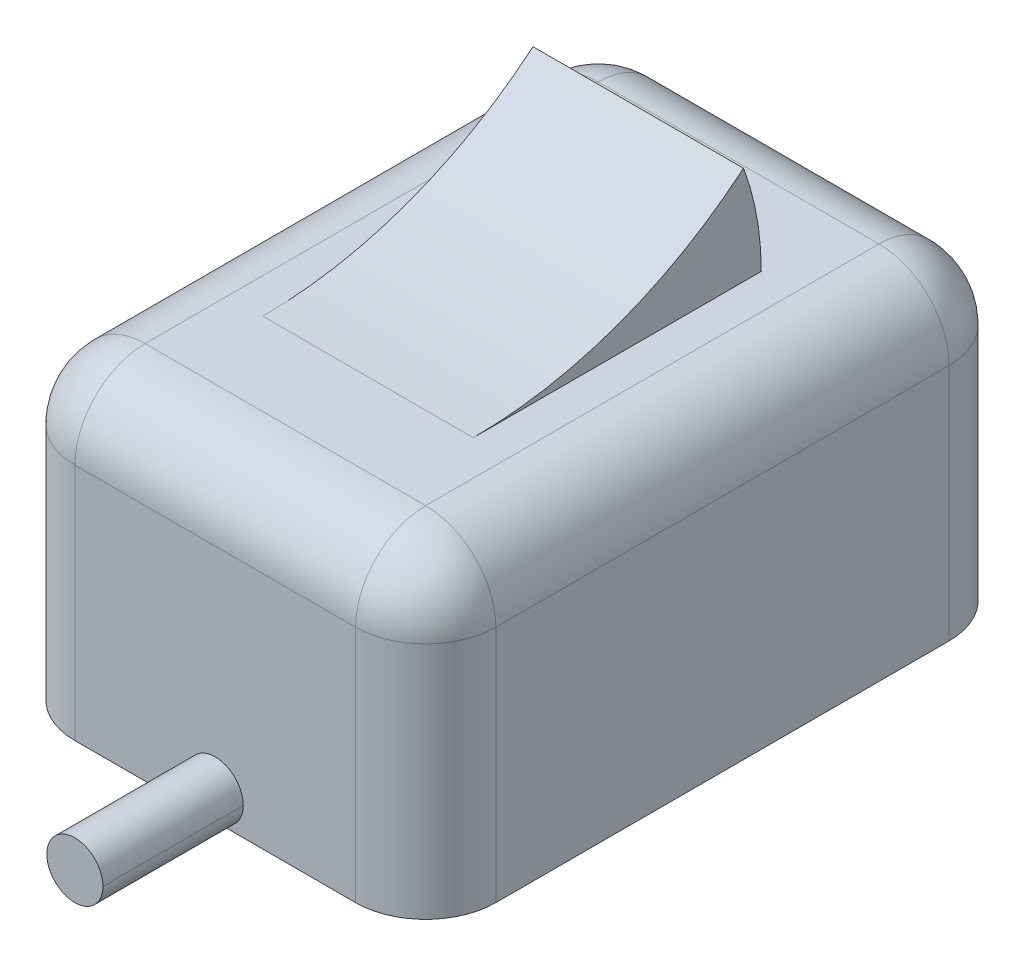
ISO-10303-21;
HEADER;
FILE_DESCRIPTION(('STEP AP214'),'2;1');
FILE_NAME('part.step','',(''),(''),'','','');
FILE_SCHEMA(('AUTOMOTIVE_DESIGN { 1 0 10303 214 1 1 1 1 }'));
ENDSEC;
DATA;
#1=APPLICATION_CONTEXT('core data for automotive mechanical design processes');
#2=APPLICATION_PROTOCOL_DEFINITION('international standard','automotive_design',2000,#1);
#3=PRODUCT_CONTEXT('',#1,'mechanical');
#4=PRODUCT('Part','Part','',(#3));
#5=PRODUCT_RELATED_PRODUCT_CATEGORY('part','',(#4));
#6=PRODUCT_DEFINITION_FORMATION('','',#4);
#7=PRODUCT_DEFINITION_CONTEXT('part definition',#1,'design');
#8=PRODUCT_DEFINITION('design','',#6,#7);
#9=PRODUCT_DEFINITION_SHAPE('','',#8);
#10=(LENGTH_UNIT() NAMED_UNIT(*) SI_UNIT(.MILLI.,.METRE.));
#11=(NAMED_UNIT(*) PLANE_ANGLE_UNIT() SI_UNIT($,.RADIAN.));
#12=(NAMED_UNIT(*) SI_UNIT($,.STERADIAN.) SOLID_ANGLE_UNIT());
#13=UNCERTAINTY_MEASURE_WITH_UNIT(LENGTH_MEASURE(1.E-05),#10,'distance_accuracy_value','');
#14=(GEOMETRIC_REPRESENTATION_CONTEXT(3) GLOBAL_UNCERTAINTY_ASSIGNED_CONTEXT((#13)) GLOBAL_UNIT_ASSIGNED_CONTEXT((#10,
#11,#12)) REPRESENTATION_CONTEXT('',''));
#15=CARTESIAN_POINT('',(0.,0.,0.));
#16=DIRECTION('',(0.,0.,1.));
#17=DIRECTION('',(1.,0.,0.));
#18=AXIS2_PLACEMENT_3D('',#15,#16,#17);
#19=CARTESIAN_POINT('',(15.,2.,10.));
#20=DIRECTION('',(0.,0.,-1.));
#21=DIRECTION('',(-1.,0.,0.));
#22=AXIS2_PLACEMENT_3D('',#19,#20,#21);
#23=CYLINDRICAL_SURFACE('',#22,2.);
#24=CARTESIAN_POINT('',(15.,2.,10.));
#25=DIRECTION('',(0.,0.,1.));
#26=DIRECTION('',(1.,0.,0.));
#27=AXIS2_PLACEMENT_3D('',#24,#25,#26);
#28=CIRCLE('',#27,2.);
#29=CARTESIAN_POINT('',(17.,2.,10.));
#30=VERTEX_POINT('',#29);
#31=CARTESIAN_POINT('',(13.,2.,10.));
#32=VERTEX_POINT('',#31);
#33=EDGE_CURVE('E188',#30,#32,#28,.T.);
#34=ORIENTED_EDGE('',*,*,#33,.F.);
#35=DIRECTION('',(0.,0.,-1.));
#36=VECTOR('',#35,1.);
#37=CARTESIAN_POINT('',(17.,2.,10.));
#38=LINE('',#37,#36);
#39=CARTESIAN_POINT('',(17.,2.,0.));
#40=VERTEX_POINT('',#39);
#41=EDGE_CURVE('E11',#30,#40,#38,.T.);
#42=ORIENTED_EDGE('',*,*,#41,.T.);
#43=CARTESIAN_POINT('',(15.,2.,0.));
#44=DIRECTION('',(0.,0.,1.));
#45=DIRECTION('',(1.,0.,0.));
#46=AXIS2_PLACEMENT_3D('',#43,#44,#45);
#47=CIRCLE('',#46,2.);
#48=CARTESIAN_POINT('',(13.,2.,0.));
#49=VERTEX_POINT('',#48);
#50=EDGE_CURVE('E195',#40,#49,#47,.T.);
#51=ORIENTED_EDGE('',*,*,#50,.T.);
#52=DIRECTION('',(0.,0.,1.));
#53=VECTOR('',#52,1.);
#54=CARTESIAN_POINT('',(13.,2.,10.));
#55=LINE('',#54,#53);
#56=EDGE_CURVE('E54',#49,#32,#55,.T.);
#57=ORIENTED_EDGE('',*,*,#56,.T.);
#58=EDGE_LOOP('',(#34,#42,#51,#57));
#59=FACE_BOUND('',#58,.T.);
#60=ADVANCED_FACE('F46',(#59),#23,.T.);
#61=CARTESIAN_POINT('',(30.,52.,-10.886817805701));
#62=DIRECTION('',(-1.,0.,0.));
#63=DIRECTION('',(0.,0.,1.));
#64=AXIS2_PLACEMENT_3D('',#61,#62,#63);
#65=CYLINDRICAL_SURFACE('',#64,30.);
#66=CARTESIAN_POINT('',(22.5,52.,-10.886817805701));
#67=DIRECTION('',(-1.,0.,0.));
#68=DIRECTION('',(0.,0.,-1.));
#69=AXIS2_PLACEMENT_3D('',#66,#67,#68);
#70=CIRCLE('',#69,30.);
#71=CARTESIAN_POINT('',(22.5,29.,-30.1481780899592));
#72=VERTEX_POINT('',#71);
#73=CARTESIAN_POINT('',(22.5,22.,-10.886815905236));
#74=VERTEX_POINT('',#73);
#75=EDGE_CURVE('E164',#72,#74,#70,.T.);
#76=ORIENTED_EDGE('',*,*,#75,.F.);
#77=DIRECTION('',(-1.,0.,0.));
#78=VECTOR('',#77,1.);
#79=CARTESIAN_POINT('',(30.,29.,-30.1481780899592));
#80=LINE('',#79,#78);
#81=CARTESIAN_POINT('',(7.5,29.,-30.1481780899592));
#82=VERTEX_POINT('',#81);
#83=EDGE_CURVE('E182',#72,#82,#80,.T.);
#84=ORIENTED_EDGE('',*,*,#83,.T.);
#85=CARTESIAN_POINT('',(7.5,52.,-10.886817805701));
#86=DIRECTION('',(1.,0.,0.));
#87=DIRECTION('',(0.,0.,1.));
#88=AXIS2_PLACEMENT_3D('',#85,#86,#87);
#89=CIRCLE('',#88,30.);
#90=CARTESIAN_POINT('',(7.5,22.,-10.886815905236));
#91=VERTEX_POINT('',#90);
#92=EDGE_CURVE('E174',#91,#82,#89,.T.);
#93=ORIENTED_EDGE('',*,*,#92,.F.);
#94=DIRECTION('',(-1.,0.,0.));
#95=VECTOR('',#94,1.);
#96=CARTESIAN_POINT('',(30.,22.,-10.886815905236));
#97=LINE('',#96,#95);
#98=EDGE_CURVE('E157',#74,#91,#97,.T.);
#99=ORIENTED_EDGE('',*,*,#98,.F.);
#100=EDGE_LOOP('',(#76,#84,#93,#99));
#101=FACE_BOUND('',#100,.T.);
#102=ADVANCED_FACE('F172',(#101),#65,.F.);
#103=CARTESIAN_POINT('',(30.,22.,-11.413184094764));
#104=DIRECTION('',(-1.,0.,0.));
#105=DIRECTION('',(0.,0.,1.));
#106=AXIS2_PLACEMENT_3D('',#103,#104,#105);
#107=CYLINDRICAL_SURFACE('',#106,20.);
#108=CARTESIAN_POINT('',(22.5,22.,-11.413184094764));
#109=DIRECTION('',(1.,0.,0.));
#110=DIRECTION('',(0.,0.,-1.));
#111=AXIS2_PLACEMENT_3D('',#108,#109,#110);
#112=CIRCLE('',#111,20.);
#113=CARTESIAN_POINT('',(22.5,22.,-31.413184094764));
#114=VERTEX_POINT('',#113);
#115=EDGE_CURVE('E163',#114,#72,#112,.T.);
#116=ORIENTED_EDGE('',*,*,#115,.F.);
#117=DIRECTION('',(-1.,0.,0.));
#118=VECTOR('',#117,1.);
#119=CARTESIAN_POINT('',(30.,22.,-31.413184094764));
#120=LINE('',#119,#118);
#121=CARTESIAN_POINT('',(7.5,22.,-31.413184094764));
#122=VERTEX_POINT('',#121);
#123=EDGE_CURVE('E161',#114,#122,#120,.T.);
#124=ORIENTED_EDGE('',*,*,#123,.T.);
#125=CARTESIAN_POINT('',(7.5,22.,-11.413184094764));
#126=DIRECTION('',(-1.,0.,0.));
#127=DIRECTION('',(0.,0.,1.));
#128=AXIS2_PLACEMENT_3D('',#125,#126,#127);
#129=CIRCLE('',#128,20.);
#130=EDGE_CURVE('E573',#82,#122,#129,.T.);
#131=ORIENTED_EDGE('',*,*,#130,.F.);
#132=ORIENTED_EDGE('',*,*,#83,.F.);
#133=EDGE_LOOP('',(#116,#124,#131,#132));
#134=FACE_BOUND('',#133,.T.);
#135=ADVANCED_FACE('F302',(#134),#107,.T.);
#136=CARTESIAN_POINT('',(0.,22.,0.));
#137=DIRECTION('',(1.,0.,0.));
#138=DIRECTION('',(0.,0.,-1.));
#139=AXIS2_PLACEMENT_3D('',#136,#137,#138);
#140=PLANE('',#139);
#141=DIRECTION('',(0.,0.,1.));
#142=VECTOR('',#141,1.);
#143=CARTESIAN_POINT('',(0.,0.,0.));
#144=LINE('',#143,#142);
#145=CARTESIAN_POINT('',(0.,0.,-37.3));
#146=VERTEX_POINT('',#145);
#147=CARTESIAN_POINT('',(0.,0.,-5.));
#148=VERTEX_POINT('',#147);
#149=EDGE_CURVE('E187',#146,#148,#144,.T.);
#150=ORIENTED_EDGE('',*,*,#149,.T.);
#151=DIRECTION('',(0.,-1.,0.));
#152=VECTOR('',#151,1.);
#153=CARTESIAN_POINT('',(0.,22.,-5.));
#154=LINE('',#153,#152);
#155=CARTESIAN_POINT('',(0.,17.,-5.));
#156=VERTEX_POINT('',#155);
#157=EDGE_CURVE('E244',#148,#156,#154,.F.);
#158=ORIENTED_EDGE('',*,*,#157,.T.);
#159=DIRECTION('',(0.,0.,1.));
#160=VECTOR('',#159,1.);
#161=CARTESIAN_POINT('',(0.,17.,0.));
#162=LINE('',#161,#160);
#163=CARTESIAN_POINT('',(0.,17.,-37.3));
#164=VERTEX_POINT('',#163);
#165=EDGE_CURVE('E241',#156,#164,#162,.F.);
#166=ORIENTED_EDGE('',*,*,#165,.T.);
#167=DIRECTION('',(0.,-1.,0.));
#168=VECTOR('',#167,1.);
#169=CARTESIAN_POINT('',(0.,22.,-37.3));
#170=LINE('',#169,#168);
#171=EDGE_CURVE('E242',#164,#146,#170,.T.);
#172=ORIENTED_EDGE('',*,*,#171,.T.);
#173=EDGE_LOOP('',(#150,#158,#166,#172));
#174=FACE_BOUND('',#173,.T.);
#175=ADVANCED_FACE('F321',(#174),#140,.F.);
#176=CARTESIAN_POINT('',(0.,22.,0.));
#177=DIRECTION('',(0.,0.,-1.));
#178=DIRECTION('',(-1.,0.,0.));
#179=AXIS2_PLACEMENT_3D('',#176,#177,#178);
#180=PLANE('',#179);
#181=DIRECTION('',(1.,0.,0.));
#182=VECTOR('',#181,1.);
#183=CARTESIAN_POINT('',(0.,0.,0.));
#184=LINE('',#183,#182);
#185=CARTESIAN_POINT('',(15.,0.,0.));
#186=VERTEX_POINT('',#185);
#187=CARTESIAN_POINT('',(25.,0.,0.));
#188=VERTEX_POINT('',#187);
#189=EDGE_CURVE('E198',#186,#188,#184,.T.);
#190=ORIENTED_EDGE('',*,*,#189,.T.);
#191=DIRECTION('',(0.,-1.,0.));
#192=VECTOR('',#191,1.);
#193=CARTESIAN_POINT('',(25.,22.,0.));
#194=LINE('',#193,#192);
#195=CARTESIAN_POINT('',(25.,17.,0.));
#196=VERTEX_POINT('',#195);
#197=EDGE_CURVE('E239',#188,#196,#194,.F.);
#198=ORIENTED_EDGE('',*,*,#197,.T.);
#199=DIRECTION('',(1.,0.,0.));
#200=VECTOR('',#199,1.);
#201=CARTESIAN_POINT('',(0.,17.,0.));
#202=LINE('',#201,#200);
#203=CARTESIAN_POINT('',(5.,17.,0.));
#204=VERTEX_POINT('',#203);
#205=EDGE_CURVE('E240',#196,#204,#202,.F.);
#206=ORIENTED_EDGE('',*,*,#205,.T.);
#207=DIRECTION('',(0.,-1.,0.));
#208=VECTOR('',#207,1.);
#209=CARTESIAN_POINT('',(5.,22.,0.));
#210=LINE('',#209,#208);
#211=CARTESIAN_POINT('',(5.,0.,0.));
#212=VERTEX_POINT('',#211);
#213=EDGE_CURVE('E234',#204,#212,#210,.T.);
#214=ORIENTED_EDGE('',*,*,#213,.T.);
#215=EDGE_CURVE('E197',#212,#186,#184,.T.);
#216=ORIENTED_EDGE('',*,*,#215,.T.);
#217=EDGE_CURVE('E191',#49,#186,#47,.T.);
#218=ORIENTED_EDGE('',*,*,#217,.F.);
#219=ORIENTED_EDGE('',*,*,#50,.F.);
#220=EDGE_CURVE('E189',#186,#40,#47,.T.);
#221=ORIENTED_EDGE('',*,*,#220,.F.);
#222=EDGE_LOOP('',(#190,#198,#206,#214,#216,#218,#219,#221));
#223=FACE_BOUND('',#222,.T.);
#224=ADVANCED_FACE('F318',(#223),#180,.F.);
#225=CARTESIAN_POINT('',(30.,22.,0.));
#226=DIRECTION('',(-1.,0.,0.));
#227=DIRECTION('',(0.,0.,1.));
#228=AXIS2_PLACEMENT_3D('',#225,#226,#227);
#229=PLANE('',#228);
#230=DIRECTION('',(0.,0.,-1.));
#231=VECTOR('',#230,1.);
#232=CARTESIAN_POINT('',(30.,0.,0.));
#233=LINE('',#232,#231);
#234=CARTESIAN_POINT('',(30.,0.,-5.));
#235=VERTEX_POINT('',#234);
#236=CARTESIAN_POINT('',(30.,0.,-37.3));
#237=VERTEX_POINT('',#236);
#238=EDGE_CURVE('E199',#235,#237,#233,.T.);
#239=ORIENTED_EDGE('',*,*,#238,.T.);
#240=DIRECTION('',(0.,-1.,0.));
#241=VECTOR('',#240,1.);
#242=CARTESIAN_POINT('',(30.,22.,-37.3));
#243=LINE('',#242,#241);
#244=CARTESIAN_POINT('',(30.,17.,-37.3));
#245=VERTEX_POINT('',#244);
#246=EDGE_CURVE('E223',#237,#245,#243,.F.);
#247=ORIENTED_EDGE('',*,*,#246,.T.);
#248=DIRECTION('',(0.,0.,-1.));
#249=VECTOR('',#248,1.);
#250=CARTESIAN_POINT('',(30.,17.,0.));
#251=LINE('',#250,#249);
#252=CARTESIAN_POINT('',(30.,17.,-5.));
#253=VERTEX_POINT('',#252);
#254=EDGE_CURVE('E224',#245,#253,#251,.F.);
#255=ORIENTED_EDGE('',*,*,#254,.T.);
#256=DIRECTION('',(0.,-1.,0.));
#257=VECTOR('',#256,1.);
#258=CARTESIAN_POINT('',(30.,22.,-5.));
#259=LINE('',#258,#257);
#260=EDGE_CURVE('E222',#253,#235,#259,.T.);
#261=ORIENTED_EDGE('',*,*,#260,.T.);
#262=EDGE_LOOP('',(#239,#247,#255,#261));
#263=FACE_BOUND('',#262,.T.);
#264=ADVANCED_FACE('F314',(#263),#229,.F.);
#265=CARTESIAN_POINT('',(0.,22.,-42.3));
#266=DIRECTION('',(0.,0.,1.));
#267=DIRECTION('',(1.,0.,0.));
#268=AXIS2_PLACEMENT_3D('',#265,#266,#267);
#269=PLANE('',#268);
#270=DIRECTION('',(-1.,0.,0.));
#271=VECTOR('',#270,1.);
#272=CARTESIAN_POINT('',(0.,17.,-42.3));
#273=LINE('',#272,#271);
#274=CARTESIAN_POINT('',(5.,17.,-42.3));
#275=VERTEX_POINT('',#274);
#276=CARTESIAN_POINT('',(25.,17.,-42.3));
#277=VERTEX_POINT('',#276);
#278=EDGE_CURVE('E206',#275,#277,#273,.F.);
#279=ORIENTED_EDGE('',*,*,#278,.T.);
#280=DIRECTION('',(0.,-1.,0.));
#281=VECTOR('',#280,1.);
#282=CARTESIAN_POINT('',(25.,22.,-42.3));
#283=LINE('',#282,#281);
#284=CARTESIAN_POINT('',(25.,0.,-42.3));
#285=VERTEX_POINT('',#284);
#286=EDGE_CURVE('E209',#277,#285,#283,.T.);
#287=ORIENTED_EDGE('',*,*,#286,.T.);
#288=DIRECTION('',(-1.,0.,0.));
#289=VECTOR('',#288,1.);
#290=CARTESIAN_POINT('',(0.,0.,-42.3));
#291=LINE('',#290,#289);
#292=CARTESIAN_POINT('',(5.,0.,-42.3));
#293=VERTEX_POINT('',#292);
#294=EDGE_CURVE('E201',#285,#293,#291,.T.);
#295=ORIENTED_EDGE('',*,*,#294,.T.);
#296=DIRECTION('',(0.,-1.,0.));
#297=VECTOR('',#296,1.);
#298=CARTESIAN_POINT('',(5.,22.,-42.3));
#299=LINE('',#298,#297);
#300=EDGE_CURVE('E208',#293,#275,#299,.F.);
#301=ORIENTED_EDGE('',*,*,#300,.T.);
#302=EDGE_LOOP('',(#279,#287,#295,#301));
#303=FACE_BOUND('',#302,.T.);
#304=ADVANCED_FACE('F306',(#303),#269,.F.);
#305=CARTESIAN_POINT('',(0.,22.,0.));
#306=DIRECTION('',(0.,-1.,0.));
#307=DIRECTION('',(0.,0.,-1.));
#308=AXIS2_PLACEMENT_3D('',#305,#306,#307);
#309=PLANE('',#308);
#310=DIRECTION('',(0.,0.,-1.));
#311=VECTOR('',#310,1.);
#312=CARTESIAN_POINT('',(22.5,22.,-10.886815905236));
#313=LINE('',#312,#311);
#314=EDGE_CURVE('E153',#74,#114,#313,.T.);
#315=ORIENTED_EDGE('',*,*,#314,.F.);
#316=ORIENTED_EDGE('',*,*,#98,.T.);
#317=DIRECTION('',(0.,0.,1.));
#318=VECTOR('',#317,1.);
#319=CARTESIAN_POINT('',(7.5,22.,-10.886815905236));
#320=LINE('',#319,#318);
#321=EDGE_CURVE('E576',#122,#91,#320,.T.);
#322=ORIENTED_EDGE('',*,*,#321,.F.);
#323=ORIENTED_EDGE('',*,*,#123,.F.);
#324=EDGE_LOOP('',(#315,#316,#322,#323));
#325=FACE_BOUND('',#324,.T.);
#326=DIRECTION('',(0.,0.,-1.));
#327=VECTOR('',#326,1.);
#328=CARTESIAN_POINT('',(25.,22.,0.));
#329=LINE('',#328,#327);
#330=CARTESIAN_POINT('',(25.,22.,-5.));
#331=VERTEX_POINT('',#330);
#332=CARTESIAN_POINT('',(25.,22.,-37.3));
#333=VERTEX_POINT('',#332);
#334=EDGE_CURVE('E231',#331,#333,#329,.T.);
#335=ORIENTED_EDGE('',*,*,#334,.T.);
#336=DIRECTION('',(-1.,0.,0.));
#337=VECTOR('',#336,1.);
#338=CARTESIAN_POINT('',(0.,22.,-37.3));
#339=LINE('',#338,#337);
#340=CARTESIAN_POINT('',(5.,22.,-37.3));
#341=VERTEX_POINT('',#340);
#342=EDGE_CURVE('E230',#333,#341,#339,.T.);
#343=ORIENTED_EDGE('',*,*,#342,.T.);
#344=DIRECTION('',(0.,0.,1.));
#345=VECTOR('',#344,1.);
#346=CARTESIAN_POINT('',(5.,22.,0.));
#347=LINE('',#346,#345);
#348=CARTESIAN_POINT('',(5.,22.,-5.));
#349=VERTEX_POINT('',#348);
#350=EDGE_CURVE('E228',#341,#349,#347,.T.);
#351=ORIENTED_EDGE('',*,*,#350,.T.);
#352=DIRECTION('',(1.,0.,0.));
#353=VECTOR('',#352,1.);
#354=CARTESIAN_POINT('',(0.,22.,-5.));
#355=LINE('',#354,#353);
#356=EDGE_CURVE('E233',#349,#331,#355,.T.);
#357=ORIENTED_EDGE('',*,*,#356,.T.);
#358=EDGE_LOOP('',(#335,#343,#351,#357));
#359=FACE_BOUND('',#358,.T.);
#360=ADVANCED_FACE('F154',(#325,#359),#309,.F.);
#361=CARTESIAN_POINT('',(0.,0.,0.));
#362=DIRECTION('',(0.,-1.,0.));
#363=DIRECTION('',(0.,0.,-1.));
#364=AXIS2_PLACEMENT_3D('',#361,#362,#363);
#365=PLANE('',#364);
#366=ORIENTED_EDGE('',*,*,#294,.F.);
#367=CARTESIAN_POINT('',(25.,0.,-37.3));
#368=DIRECTION('',(0.,-1.,0.));
#369=DIRECTION('',(0.,0.,-1.));
#370=AXIS2_PLACEMENT_3D('',#367,#368,#369);
#371=CIRCLE('',#370,5.);
#372=EDGE_CURVE('E218',#285,#237,#371,.T.);
#373=ORIENTED_EDGE('',*,*,#372,.T.);
#374=ORIENTED_EDGE('',*,*,#238,.F.);
#375=CARTESIAN_POINT('',(25.,0.,-5.));
#376=DIRECTION('',(0.,-1.,0.));
#377=DIRECTION('',(0.,0.,-1.));
#378=AXIS2_PLACEMENT_3D('',#375,#376,#377);
#379=CIRCLE('',#378,5.);
#380=EDGE_CURVE('E220',#235,#188,#379,.T.);
#381=ORIENTED_EDGE('',*,*,#380,.T.);
#382=ORIENTED_EDGE('',*,*,#189,.F.);
#383=ORIENTED_EDGE('',*,*,#215,.F.);
#384=CARTESIAN_POINT('',(5.,0.,-5.));
#385=DIRECTION('',(0.,-1.,0.));
#386=DIRECTION('',(0.,0.,-1.));
#387=AXIS2_PLACEMENT_3D('',#384,#385,#386);
#388=CIRCLE('',#387,5.);
#389=EDGE_CURVE('E214',#212,#148,#388,.T.);
#390=ORIENTED_EDGE('',*,*,#389,.T.);
#391=ORIENTED_EDGE('',*,*,#149,.F.);
#392=CARTESIAN_POINT('',(5.,0.,-37.3));
#393=DIRECTION('',(0.,-1.,0.));
#394=DIRECTION('',(0.,0.,-1.));
#395=AXIS2_PLACEMENT_3D('',#392,#393,#394);
#396=CIRCLE('',#395,5.);
#397=EDGE_CURVE('E213',#146,#293,#396,.T.);
#398=ORIENTED_EDGE('',*,*,#397,.T.);
#399=EDGE_LOOP('',(#366,#373,#374,#381,#382,#383,#390,#391,#398));
#400=FACE_BOUND('',#399,.T.);
#401=ADVANCED_FACE('F293',(#400),#365,.T.);
#402=ORIENTED_EDGE('',*,*,#41,.F.);
#403=EDGE_CURVE('E183',#32,#30,#28,.T.);
#404=ORIENTED_EDGE('',*,*,#403,.F.);
#405=ORIENTED_EDGE('',*,*,#56,.F.);
#406=ORIENTED_EDGE('',*,*,#217,.T.);
#407=ORIENTED_EDGE('',*,*,#220,.T.);
#408=EDGE_LOOP('',(#402,#404,#405,#406,#407));
#409=FACE_BOUND('',#408,.T.);
#410=ADVANCED_FACE('F283',(#409),#23,.T.);
#411=CARTESIAN_POINT('',(15.,2.,10.));
#412=DIRECTION('',(0.,0.,1.));
#413=DIRECTION('',(1.,0.,0.));
#414=AXIS2_PLACEMENT_3D('',#411,#412,#413);
#415=PLANE('',#414);
#416=ORIENTED_EDGE('',*,*,#403,.T.);
#417=ORIENTED_EDGE('',*,*,#33,.T.);
#418=EDGE_LOOP('',(#416,#417));
#419=FACE_BOUND('',#418,.T.);
#420=ADVANCED_FACE('F288',(#419),#415,.T.);
#421=CARTESIAN_POINT('',(5.,22.,-5.));
#422=DIRECTION('',(0.,-1.,0.));
#423=DIRECTION('',(0.,0.,-1.));
#424=AXIS2_PLACEMENT_3D('',#421,#422,#423);
#425=CYLINDRICAL_SURFACE('',#424,5.);
#426=CARTESIAN_POINT('',(5.,17.,-5.));
#427=DIRECTION('',(0.,1.,0.));
#428=DIRECTION('',(0.,0.,1.));
#429=AXIS2_PLACEMENT_3D('',#426,#427,#428);
#430=CIRCLE('',#429,5.);
#431=EDGE_CURVE('E277',#156,#204,#430,.T.);
#432=ORIENTED_EDGE('',*,*,#431,.F.);
#433=ORIENTED_EDGE('',*,*,#157,.F.);
#434=ORIENTED_EDGE('',*,*,#389,.F.);
#435=ORIENTED_EDGE('',*,*,#213,.F.);
#436=EDGE_LOOP('',(#432,#433,#434,#435));
#437=FACE_BOUND('',#436,.T.);
#438=ADVANCED_FACE('F48',(#437),#425,.T.);
#439=CARTESIAN_POINT('',(5.,17.,-5.));
#440=DIRECTION('',(0.,0.,1.));
#441=DIRECTION('',(1.,0.,0.));
#442=AXIS2_PLACEMENT_3D('',#439,#440,#441);
#443=SPHERICAL_SURFACE('',#442,5.);
#444=CARTESIAN_POINT('',(5.,17.,-5.));
#445=DIRECTION('',(0.,0.,1.));
#446=DIRECTION('',(1.,0.,0.));
#447=AXIS2_PLACEMENT_3D('',#444,#445,#446);
#448=CIRCLE('',#447,5.);
#449=EDGE_CURVE('E269',#156,#349,#448,.F.);
#450=ORIENTED_EDGE('',*,*,#449,.F.);
#451=ORIENTED_EDGE('',*,*,#431,.T.);
#452=CARTESIAN_POINT('',(5.,17.,-5.));
#453=DIRECTION('',(-1.,0.,0.));
#454=DIRECTION('',(0.,0.,1.));
#455=AXIS2_PLACEMENT_3D('',#452,#453,#454);
#456=CIRCLE('',#455,5.);
#457=EDGE_CURVE('E272',#349,#204,#456,.F.);
#458=ORIENTED_EDGE('',*,*,#457,.F.);
#459=EDGE_LOOP('',(#450,#451,#458));
#460=FACE_BOUND('',#459,.T.);
#461=ADVANCED_FACE('F291',(#460),#443,.T.);
#462=CARTESIAN_POINT('',(25.,22.,-5.));
#463=DIRECTION('',(0.,-1.,0.));
#464=DIRECTION('',(0.,0.,-1.));
#465=AXIS2_PLACEMENT_3D('',#462,#463,#464);
#466=CYLINDRICAL_SURFACE('',#465,5.);
#467=ORIENTED_EDGE('',*,*,#380,.F.);
#468=ORIENTED_EDGE('',*,*,#260,.F.);
#469=CARTESIAN_POINT('',(25.,17.,-5.));
#470=DIRECTION('',(0.,1.,0.));
#471=DIRECTION('',(0.,0.,1.));
#472=AXIS2_PLACEMENT_3D('',#469,#470,#471);
#473=CIRCLE('',#472,5.);
#474=EDGE_CURVE('E270',#196,#253,#473,.T.);
#475=ORIENTED_EDGE('',*,*,#474,.F.);
#476=ORIENTED_EDGE('',*,*,#197,.F.);
#477=EDGE_LOOP('',(#467,#468,#475,#476));
#478=FACE_BOUND('',#477,.T.);
#479=ADVANCED_FACE('F362',(#478),#466,.T.);
#480=CARTESIAN_POINT('',(0.,17.,-5.));
#481=DIRECTION('',(1.,0.,0.));
#482=DIRECTION('',(0.,0.,-1.));
#483=AXIS2_PLACEMENT_3D('',#480,#481,#482);
#484=CYLINDRICAL_SURFACE('',#483,5.);
#485=ORIENTED_EDGE('',*,*,#457,.T.);
#486=ORIENTED_EDGE('',*,*,#205,.F.);
#487=CARTESIAN_POINT('',(25.,17.,-5.));
#488=DIRECTION('',(1.,0.,0.));
#489=DIRECTION('',(0.,0.,-1.));
#490=AXIS2_PLACEMENT_3D('',#487,#488,#489);
#491=CIRCLE('',#490,5.);
#492=EDGE_CURVE('E262',#331,#196,#491,.T.);
#493=ORIENTED_EDGE('',*,*,#492,.F.);
#494=ORIENTED_EDGE('',*,*,#356,.F.);
#495=EDGE_LOOP('',(#485,#486,#493,#494));
#496=FACE_BOUND('',#495,.T.);
#497=ADVANCED_FACE('F356',(#496),#484,.T.);
#498=CARTESIAN_POINT('',(5.,17.,0.));
#499=DIRECTION('',(0.,0.,1.));
#500=DIRECTION('',(1.,0.,0.));
#501=AXIS2_PLACEMENT_3D('',#498,#499,#500);
#502=CYLINDRICAL_SURFACE('',#501,5.);
#503=ORIENTED_EDGE('',*,*,#449,.T.);
#504=ORIENTED_EDGE('',*,*,#350,.F.);
#505=CARTESIAN_POINT('',(5.,17.,-37.3));
#506=DIRECTION('',(0.,0.,-1.));
#507=DIRECTION('',(-1.,0.,0.));
#508=AXIS2_PLACEMENT_3D('',#505,#506,#507);
#509=CIRCLE('',#508,5.);
#510=EDGE_CURVE('E261',#164,#341,#509,.T.);
#511=ORIENTED_EDGE('',*,*,#510,.F.);
#512=ORIENTED_EDGE('',*,*,#165,.F.);
#513=EDGE_LOOP('',(#503,#504,#511,#512));
#514=FACE_BOUND('',#513,.T.);
#515=ADVANCED_FACE('F353',(#514),#502,.T.);
#516=CARTESIAN_POINT('',(5.,22.,-37.3));
#517=DIRECTION('',(0.,-1.,0.));
#518=DIRECTION('',(0.,0.,-1.));
#519=AXIS2_PLACEMENT_3D('',#516,#517,#518);
#520=CYLINDRICAL_SURFACE('',#519,5.);
#521=ORIENTED_EDGE('',*,*,#397,.F.);
#522=ORIENTED_EDGE('',*,*,#171,.F.);
#523=CARTESIAN_POINT('',(5.,17.,-37.3));
#524=DIRECTION('',(0.,1.,0.));
#525=DIRECTION('',(0.,0.,1.));
#526=AXIS2_PLACEMENT_3D('',#523,#524,#525);
#527=CIRCLE('',#526,5.);
#528=EDGE_CURVE('E256',#275,#164,#527,.T.);
#529=ORIENTED_EDGE('',*,*,#528,.F.);
#530=ORIENTED_EDGE('',*,*,#300,.F.);
#531=EDGE_LOOP('',(#521,#522,#529,#530));
#532=FACE_BOUND('',#531,.T.);
#533=ADVANCED_FACE('F348',(#532),#520,.T.);
#534=CARTESIAN_POINT('',(25.,17.,-5.));
#535=DIRECTION('',(0.,0.,1.));
#536=DIRECTION('',(1.,0.,0.));
#537=AXIS2_PLACEMENT_3D('',#534,#535,#536);
#538=SPHERICAL_SURFACE('',#537,5.);
#539=ORIENTED_EDGE('',*,*,#492,.T.);
#540=ORIENTED_EDGE('',*,*,#474,.T.);
#541=CARTESIAN_POINT('',(25.,17.,-5.));
#542=DIRECTION('',(0.,0.,1.));
#543=DIRECTION('',(1.,0.,0.));
#544=AXIS2_PLACEMENT_3D('',#541,#542,#543);
#545=CIRCLE('',#544,5.);
#546=EDGE_CURVE('E254',#331,#253,#545,.F.);
#547=ORIENTED_EDGE('',*,*,#546,.F.);
#548=EDGE_LOOP('',(#539,#540,#547));
#549=FACE_BOUND('',#548,.T.);
#550=ADVANCED_FACE('F347',(#549),#538,.T.);
#551=CARTESIAN_POINT('',(5.,17.,-37.3));
#552=DIRECTION('',(-1.,0.,0.));
#553=DIRECTION('',(0.,0.,1.));
#554=AXIS2_PLACEMENT_3D('',#551,#552,#553);
#555=SPHERICAL_SURFACE('',#554,5.);
#556=ORIENTED_EDGE('',*,*,#528,.T.);
#557=ORIENTED_EDGE('',*,*,#510,.T.);
#558=CARTESIAN_POINT('',(5.,17.,-37.3));
#559=DIRECTION('',(-1.,0.,0.));
#560=DIRECTION('',(0.,0.,1.));
#561=AXIS2_PLACEMENT_3D('',#558,#559,#560);
#562=CIRCLE('',#561,5.);
#563=EDGE_CURVE('E252',#275,#341,#562,.F.);
#564=ORIENTED_EDGE('',*,*,#563,.F.);
#565=EDGE_LOOP('',(#556,#557,#564));
#566=FACE_BOUND('',#565,.T.);
#567=ADVANCED_FACE('F345',(#566),#555,.T.);
#568=CARTESIAN_POINT('',(25.,17.,0.));
#569=DIRECTION('',(0.,0.,-1.));
#570=DIRECTION('',(-1.,0.,0.));
#571=AXIS2_PLACEMENT_3D('',#568,#569,#570);
#572=CYLINDRICAL_SURFACE('',#571,5.);
#573=ORIENTED_EDGE('',*,*,#546,.T.);
#574=ORIENTED_EDGE('',*,*,#254,.F.);
#575=CARTESIAN_POINT('',(25.,17.,-37.3));
#576=DIRECTION('',(0.,0.,-1.));
#577=DIRECTION('',(-1.,0.,0.));
#578=AXIS2_PLACEMENT_3D('',#575,#576,#577);
#579=CIRCLE('',#578,5.);
#580=EDGE_CURVE('E247',#333,#245,#579,.T.);
#581=ORIENTED_EDGE('',*,*,#580,.F.);
#582=ORIENTED_EDGE('',*,*,#334,.F.);
#583=EDGE_LOOP('',(#573,#574,#581,#582));
#584=FACE_BOUND('',#583,.T.);
#585=ADVANCED_FACE('F337',(#584),#572,.T.);
#586=CARTESIAN_POINT('',(0.,17.,-37.3));
#587=DIRECTION('',(-1.,0.,0.));
#588=DIRECTION('',(0.,0.,1.));
#589=AXIS2_PLACEMENT_3D('',#586,#587,#588);
#590=CYLINDRICAL_SURFACE('',#589,5.);
#591=ORIENTED_EDGE('',*,*,#563,.T.);
#592=ORIENTED_EDGE('',*,*,#342,.F.);
#593=CARTESIAN_POINT('',(25.,17.,-37.3));
#594=DIRECTION('',(1.,0.,0.));
#595=DIRECTION('',(0.,0.,-1.));
#596=AXIS2_PLACEMENT_3D('',#593,#594,#595);
#597=CIRCLE('',#596,5.);
#598=EDGE_CURVE('E177',#277,#333,#597,.T.);
#599=ORIENTED_EDGE('',*,*,#598,.F.);
#600=ORIENTED_EDGE('',*,*,#278,.F.);
#601=EDGE_LOOP('',(#591,#592,#599,#600));
#602=FACE_BOUND('',#601,.T.);
#603=ADVANCED_FACE('F331',(#602),#590,.T.);
#604=CARTESIAN_POINT('',(25.,17.,-37.3));
#605=DIRECTION('',(0.,1.,0.));
#606=DIRECTION('',(0.,0.,1.));
#607=AXIS2_PLACEMENT_3D('',#604,#605,#606);
#608=SPHERICAL_SURFACE('',#607,5.);
#609=ORIENTED_EDGE('',*,*,#598,.T.);
#610=ORIENTED_EDGE('',*,*,#580,.T.);
#611=CARTESIAN_POINT('',(25.,17.,-37.3));
#612=DIRECTION('',(0.,1.,0.));
#613=DIRECTION('',(0.,0.,1.));
#614=AXIS2_PLACEMENT_3D('',#611,#612,#613);
#615=CIRCLE('',#614,5.);
#616=EDGE_CURVE('E178',#277,#245,#615,.F.);
#617=ORIENTED_EDGE('',*,*,#616,.F.);
#618=EDGE_LOOP('',(#609,#610,#617));
#619=FACE_BOUND('',#618,.T.);
#620=ADVANCED_FACE('F329',(#619),#608,.T.);
#621=CARTESIAN_POINT('',(25.,22.,-37.3));
#622=DIRECTION('',(0.,-1.,0.));
#623=DIRECTION('',(0.,0.,-1.));
#624=AXIS2_PLACEMENT_3D('',#621,#622,#623);
#625=CYLINDRICAL_SURFACE('',#624,5.);
#626=ORIENTED_EDGE('',*,*,#616,.T.);
#627=ORIENTED_EDGE('',*,*,#246,.F.);
#628=ORIENTED_EDGE('',*,*,#372,.F.);
#629=ORIENTED_EDGE('',*,*,#286,.F.);
#630=EDGE_LOOP('',(#626,#627,#628,#629));
#631=FACE_BOUND('',#630,.T.);
#632=ADVANCED_FACE('F326',(#631),#625,.T.);
#633=CARTESIAN_POINT('',(7.5,52.,-10.886817805701));
#634=DIRECTION('',(-1.,0.,0.));
#635=DIRECTION('',(0.,0.,1.));
#636=AXIS2_PLACEMENT_3D('',#633,#634,#635);
#637=PLANE('',#636);
#638=ORIENTED_EDGE('',*,*,#92,.T.);
#639=ORIENTED_EDGE('',*,*,#130,.T.);
#640=ORIENTED_EDGE('',*,*,#321,.T.);
#641=EDGE_LOOP('',(#638,#639,#640));
#642=FACE_BOUND('',#641,.T.);
#643=ADVANCED_FACE('F328',(#642),#637,.T.);
#644=CARTESIAN_POINT('',(22.5,52.,-10.886817805701));
#645=DIRECTION('',(1.,0.,0.));
#646=DIRECTION('',(0.,0.,-1.));
#647=AXIS2_PLACEMENT_3D('',#644,#645,#646);
#648=PLANE('',#647);
#649=ORIENTED_EDGE('',*,*,#75,.T.);
#650=ORIENTED_EDGE('',*,*,#314,.T.);
#651=ORIENTED_EDGE('',*,*,#115,.T.);
#652=EDGE_LOOP('',(#649,#650,#651));
#653=FACE_BOUND('',#652,.T.);
#654=ADVANCED_FACE('F169',(#653),#648,.T.);
#655=CLOSED_SHELL('',(#60,#102,#135,#175,#224,#264,#304,#360,#401,#410,#420,#438,#461,#479,#497,
#515,#533,#550,#567,#585,#603,#620,#632,#643,#654));
#656=MANIFOLD_SOLID_BREP('B2',#655);
#657=ADVANCED_BREP_SHAPE_REPRESENTATION('',(#18,#656),#14);
#658=SHAPE_DEFINITION_REPRESENTATION(#9,#657);
ENDSEC;
END-ISO-10303-21;
